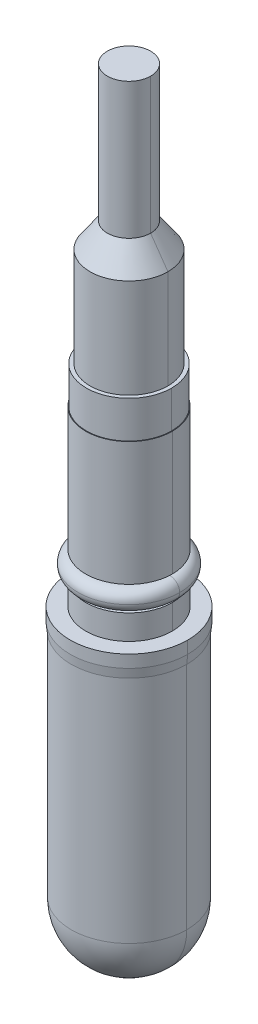
ISO-10303-21;
HEADER;
FILE_DESCRIPTION(('STEP AP214'),'2;1');
FILE_NAME('part.step','',(''),(''),'','','');
FILE_SCHEMA(('AUTOMOTIVE_DESIGN { 1 0 10303 214 1 1 1 1 }'));
ENDSEC;
DATA;
#1=APPLICATION_CONTEXT('core data for automotive mechanical design processes');
#2=APPLICATION_PROTOCOL_DEFINITION('international standard','automotive_design',2000,#1);
#3=PRODUCT_CONTEXT('',#1,'mechanical');
#4=PRODUCT('Part','Part','',(#3));
#5=PRODUCT_RELATED_PRODUCT_CATEGORY('part','',(#4));
#6=PRODUCT_DEFINITION_FORMATION('','',#4);
#7=PRODUCT_DEFINITION_CONTEXT('part definition',#1,'design');
#8=PRODUCT_DEFINITION('design','',#6,#7);
#9=PRODUCT_DEFINITION_SHAPE('','',#8);
#10=(LENGTH_UNIT() NAMED_UNIT(*) SI_UNIT(.MILLI.,.METRE.));
#11=(NAMED_UNIT(*) PLANE_ANGLE_UNIT() SI_UNIT($,.RADIAN.));
#12=(NAMED_UNIT(*) SI_UNIT($,.STERADIAN.) SOLID_ANGLE_UNIT());
#13=UNCERTAINTY_MEASURE_WITH_UNIT(LENGTH_MEASURE(1.E-05),#10,'distance_accuracy_value','');
#14=(GEOMETRIC_REPRESENTATION_CONTEXT(3) GLOBAL_UNCERTAINTY_ASSIGNED_CONTEXT((#13)) GLOBAL_UNIT_ASSIGNED_CONTEXT((#10,
#11,#12)) REPRESENTATION_CONTEXT('',''));
#15=CARTESIAN_POINT('',(0.,0.,0.));
#16=DIRECTION('',(0.,0.,1.));
#17=DIRECTION('',(1.,0.,0.));
#18=AXIS2_PLACEMENT_3D('',#15,#16,#17);
#19=CARTESIAN_POINT('',(0.,3.,0.));
#20=DIRECTION('',(0.,-1.,0.));
#21=DIRECTION('',(-1.,0.,0.));
#22=AXIS2_PLACEMENT_3D('',#19,#20,#21);
#23=TOROIDAL_SURFACE('',#22,3.3,0.8);
#24=CARTESIAN_POINT('',(0.,3.,0.));
#25=DIRECTION('',(0.,-1.,0.));
#26=DIRECTION('',(-1.,0.,0.));
#27=AXIS2_PLACEMENT_3D('',#24,#25,#26);
#28=CIRCLE('',#27,4.1);
#29=CARTESIAN_POINT('',(4.1,3.,0.));
#30=VERTEX_POINT('',#29);
#31=CARTESIAN_POINT('',(-4.1,3.,0.));
#32=VERTEX_POINT('',#31);
#33=EDGE_CURVE('P0_E34',#30,#32,#28,.F.);
#34=ORIENTED_EDGE('',*,*,#33,.F.);
#35=CARTESIAN_POINT('',(3.3,3.,0.));
#36=DIRECTION('',(0.,0.,1.));
#37=DIRECTION('',(1.,0.,0.));
#38=AXIS2_PLACEMENT_3D('',#35,#36,#37);
#39=CIRCLE('',#38,0.8);
#40=CARTESIAN_POINT('',(2.5,3.,0.));
#41=VERTEX_POINT('',#40);
#42=EDGE_CURVE('P0_E39',#41,#30,#39,.T.);
#43=ORIENTED_EDGE('',*,*,#42,.F.);
#44=CARTESIAN_POINT('',(0.,3.,0.));
#45=DIRECTION('',(0.,-1.,0.));
#46=DIRECTION('',(-1.,0.,0.));
#47=AXIS2_PLACEMENT_3D('',#44,#45,#46);
#48=CIRCLE('',#47,2.5);
#49=CARTESIAN_POINT('',(-2.5,3.,0.));
#50=VERTEX_POINT('',#49);
#51=EDGE_CURVE('P0_E42',#50,#41,#48,.T.);
#52=ORIENTED_EDGE('',*,*,#51,.F.);
#53=CARTESIAN_POINT('',(-3.3,3.,0.));
#54=DIRECTION('',(0.,0.,-1.));
#55=DIRECTION('',(-1.,0.,0.));
#56=AXIS2_PLACEMENT_3D('',#53,#54,#55);
#57=CIRCLE('',#56,0.8);
#58=EDGE_CURVE('P0_E44',#32,#50,#57,.F.);
#59=ORIENTED_EDGE('',*,*,#58,.F.);
#60=EDGE_LOOP('',(#34,#43,#52,#59));
#61=FACE_BOUND('',#60,.T.);
#62=ADVANCED_FACE('P0_F16',(#61),#23,.T.);
#63=CARTESIAN_POINT('',(0.,3.,0.));
#64=DIRECTION('',(0.,-1.,0.));
#65=DIRECTION('',(-1.,0.,0.));
#66=AXIS2_PLACEMENT_3D('',#63,#64,#65);
#67=TOROIDAL_SURFACE('',#66,3.3,0.8);
#68=CARTESIAN_POINT('',(0.,3.,0.));
#69=DIRECTION('',(0.,-1.,0.));
#70=DIRECTION('',(-1.,0.,0.));
#71=AXIS2_PLACEMENT_3D('',#68,#69,#70);
#72=CIRCLE('',#71,2.5);
#73=EDGE_CURVE('P0_E48',#41,#50,#72,.T.);
#74=ORIENTED_EDGE('',*,*,#73,.F.);
#75=ORIENTED_EDGE('',*,*,#42,.T.);
#76=CARTESIAN_POINT('',(0.,3.,0.));
#77=DIRECTION('',(0.,-1.,0.));
#78=DIRECTION('',(-1.,0.,0.));
#79=AXIS2_PLACEMENT_3D('',#76,#77,#78);
#80=CIRCLE('',#79,4.1);
#81=EDGE_CURVE('P0_E25',#32,#30,#80,.F.);
#82=ORIENTED_EDGE('',*,*,#81,.F.);
#83=ORIENTED_EDGE('',*,*,#58,.T.);
#84=EDGE_LOOP('',(#74,#75,#82,#83));
#85=FACE_BOUND('',#84,.T.);
#86=ADVANCED_FACE('P0_F52',(#85),#67,.T.);
#87=CARTESIAN_POINT('',(0.,3.,0.));
#88=DIRECTION('',(0.,-1.,0.));
#89=DIRECTION('',(-1.,0.,0.));
#90=AXIS2_PLACEMENT_3D('',#87,#88,#89);
#91=TOROIDAL_SURFACE('',#90,3.3,0.8);
#92=ORIENTED_EDGE('',*,*,#51,.T.);
#93=CARTESIAN_POINT('',(3.3,3.,0.));
#94=DIRECTION('',(0.,0.,1.));
#95=DIRECTION('',(1.,0.,0.));
#96=AXIS2_PLACEMENT_3D('',#93,#94,#95);
#97=CIRCLE('',#96,0.8);
#98=EDGE_CURVE('P0_E11',#30,#41,#97,.T.);
#99=ORIENTED_EDGE('',*,*,#98,.F.);
#100=ORIENTED_EDGE('',*,*,#33,.T.);
#101=CARTESIAN_POINT('',(-3.3,3.,0.));
#102=DIRECTION('',(0.,0.,-1.));
#103=DIRECTION('',(-1.,0.,0.));
#104=AXIS2_PLACEMENT_3D('',#101,#102,#103);
#105=CIRCLE('',#104,0.8);
#106=EDGE_CURVE('P0_E56',#50,#32,#105,.F.);
#107=ORIENTED_EDGE('',*,*,#106,.F.);
#108=EDGE_LOOP('',(#92,#99,#100,#107));
#109=FACE_BOUND('',#108,.T.);
#110=ADVANCED_FACE('P0_F57',(#109),#91,.T.);
#111=CARTESIAN_POINT('',(0.,3.,0.));
#112=DIRECTION('',(0.,-1.,0.));
#113=DIRECTION('',(-1.,0.,0.));
#114=AXIS2_PLACEMENT_3D('',#111,#112,#113);
#115=TOROIDAL_SURFACE('',#114,3.3,0.8);
#116=ORIENTED_EDGE('',*,*,#81,.T.);
#117=ORIENTED_EDGE('',*,*,#98,.T.);
#118=ORIENTED_EDGE('',*,*,#73,.T.);
#119=ORIENTED_EDGE('',*,*,#106,.T.);
#120=EDGE_LOOP('',(#116,#117,#118,#119));
#121=FACE_BOUND('',#120,.T.);
#122=ADVANCED_FACE('P0_F60',(#121),#115,.T.);
#123=CLOSED_SHELL('',(#62,#86,#110,#122));
#124=MANIFOLD_SOLID_BREP('P0_B1',#123);
#125=CARTESIAN_POINT('',(0.,38.,0.));
#126=DIRECTION('',(0.,-1.,0.));
#127=DIRECTION('',(0.,0.,-1.));
#128=AXIS2_PLACEMENT_3D('',#125,#126,#127);
#129=PLANE('',#128);
#130=CARTESIAN_POINT('',(0.,38.,0.));
#131=DIRECTION('',(0.,-1.,0.));
#132=DIRECTION('',(0.,0.,-1.));
#133=AXIS2_PLACEMENT_3D('',#130,#131,#132);
#134=CIRCLE('',#133,1.75000000000037);
#135=CARTESIAN_POINT('',(-1.75000000000037,38.,0.));
#136=VERTEX_POINT('',#135);
#137=CARTESIAN_POINT('',(1.75000000000037,38.,0.));
#138=VERTEX_POINT('',#137);
#139=EDGE_CURVE('P1_E137',#136,#138,#134,.T.);
#140=ORIENTED_EDGE('',*,*,#139,.F.);
#141=CARTESIAN_POINT('',(0.,38.,0.));
#142=DIRECTION('',(0.,-1.,0.));
#143=DIRECTION('',(0.,0.,-1.));
#144=AXIS2_PLACEMENT_3D('',#141,#142,#143);
#145=CIRCLE('',#144,1.75000000000037);
#146=EDGE_CURVE('P1_E19',#138,#136,#145,.T.);
#147=ORIENTED_EDGE('',*,*,#146,.F.);
#148=EDGE_LOOP('',(#140,#147));
#149=FACE_BOUND('',#148,.T.);
#150=ADVANCED_FACE('P1_F16',(#149),#129,.F.);
#151=CARTESIAN_POINT('',(0.,38.0745782775969,0.));
#152=DIRECTION('',(0.,-1.,0.));
#153=DIRECTION('',(0.,0.,-1.));
#154=AXIS2_PLACEMENT_3D('',#151,#152,#153);
#155=CYLINDRICAL_SURFACE('',#154,1.75000000000037);
#156=CARTESIAN_POINT('',(0.,26.9999999999868,0.));
#157=DIRECTION('',(0.,-1.,0.));
#158=DIRECTION('',(-1.,0.,0.));
#159=AXIS2_PLACEMENT_3D('',#156,#157,#158);
#160=CIRCLE('',#159,1.75000000001546);
#161=CARTESIAN_POINT('',(1.7500000000259,26.9999999999759,0.));
#162=VERTEX_POINT('',#161);
#163=CARTESIAN_POINT('',(-1.7500000000259,26.9999999999655,0.));
#164=VERTEX_POINT('',#163);
#165=EDGE_CURVE('P1_E247',#162,#164,#160,.T.);
#166=ORIENTED_EDGE('',*,*,#165,.F.);
#167=DIRECTION('',(0.,-1.,0.));
#168=VECTOR('',#167,1.);
#169=CARTESIAN_POINT('',(1.75000000000037,38.0745782775969,0.));
#170=LINE('',#169,#168);
#171=EDGE_CURVE('P1_E135',#138,#162,#170,.T.);
#172=ORIENTED_EDGE('',*,*,#171,.F.);
#173=ORIENTED_EDGE('',*,*,#146,.T.);
#174=DIRECTION('',(0.,-1.,0.));
#175=VECTOR('',#174,1.);
#176=CARTESIAN_POINT('',(-1.75000000000037,38.0745782775969,0.));
#177=LINE('',#176,#175);
#178=EDGE_CURVE('P1_E132',#164,#136,#177,.F.);
#179=ORIENTED_EDGE('',*,*,#178,.F.);
#180=EDGE_LOOP('',(#166,#172,#173,#179));
#181=FACE_BOUND('',#180,.T.);
#182=ADVANCED_FACE('P1_F130',(#181),#155,.T.);
#183=CARTESIAN_POINT('',(0.,38.0745782775969,0.));
#184=DIRECTION('',(0.,-1.,0.));
#185=DIRECTION('',(0.,0.,-1.));
#186=AXIS2_PLACEMENT_3D('',#183,#184,#185);
#187=CYLINDRICAL_SURFACE('',#186,1.75000000000037);
#188=ORIENTED_EDGE('',*,*,#139,.T.);
#189=ORIENTED_EDGE('',*,*,#171,.T.);
#190=CARTESIAN_POINT('',(0.,26.9999999999868,0.));
#191=DIRECTION('',(0.,-1.,0.));
#192=DIRECTION('',(-1.,0.,0.));
#193=AXIS2_PLACEMENT_3D('',#190,#191,#192);
#194=CIRCLE('',#193,1.75000000001546);
#195=EDGE_CURVE('P1_E142',#164,#162,#194,.T.);
#196=ORIENTED_EDGE('',*,*,#195,.F.);
#197=ORIENTED_EDGE('',*,*,#178,.T.);
#198=EDGE_LOOP('',(#188,#189,#196,#197));
#199=FACE_BOUND('',#198,.T.);
#200=ADVANCED_FACE('P1_F140',(#199),#187,.T.);
#201=CARTESIAN_POINT('',(0.,25.0000000000341,0.));
#202=DIRECTION('',(0.,-1.,0.));
#203=DIRECTION('',(0.,0.,-1.));
#204=AXIS2_PLACEMENT_3D('',#201,#202,#203);
#205=CONICAL_SURFACE('',#204,3.15000000000509,0.610725964391116);
#206=CARTESIAN_POINT('',(0.,25.,0.));
#207=DIRECTION('',(0.,-1.,0.));
#208=DIRECTION('',(0.,0.,-1.));
#209=AXIS2_PLACEMENT_3D('',#206,#207,#208);
#210=CIRCLE('',#209,3.15);
#211=CARTESIAN_POINT('',(3.15000000000127,25.0000000000085,0.));
#212=VERTEX_POINT('',#211);
#213=CARTESIAN_POINT('',(-3.15000000001548,24.9999999999801,0.));
#214=VERTEX_POINT('',#213);
#215=EDGE_CURVE('P1_E231',#212,#214,#210,.T.);
#216=ORIENTED_EDGE('',*,*,#215,.F.);
#217=DIRECTION('',(-0.573462344363226,0.819231920519112,0.));
#218=VECTOR('',#217,1.);
#219=CARTESIAN_POINT('',(349320.649999907,-499000.,-4.27794415898459E-11));
#220=LINE('',#219,#218);
#221=EDGE_CURVE('P1_E236',#162,#212,#220,.F.);
#222=ORIENTED_EDGE('',*,*,#221,.F.);
#223=ORIENTED_EDGE('',*,*,#165,.T.);
#224=DIRECTION('',(0.573462344363226,0.819231920519112,0.));
#225=VECTOR('',#224,1.);
#226=CARTESIAN_POINT('',(-349320.649999907,-499000.,0.));
#227=LINE('',#226,#225);
#228=EDGE_CURVE('P1_E245',#214,#164,#227,.T.);
#229=ORIENTED_EDGE('',*,*,#228,.F.);
#230=EDGE_LOOP('',(#216,#222,#223,#229));
#231=FACE_BOUND('',#230,.T.);
#232=ADVANCED_FACE('P1_F257',(#231),#205,.T.);
#233=CARTESIAN_POINT('',(0.,25.0000000000341,0.));
#234=DIRECTION('',(0.,-1.,0.));
#235=DIRECTION('',(0.,0.,-1.));
#236=AXIS2_PLACEMENT_3D('',#233,#234,#235);
#237=CONICAL_SURFACE('',#236,3.15000000000509,0.610725964391116);
#238=ORIENTED_EDGE('',*,*,#195,.T.);
#239=ORIENTED_EDGE('',*,*,#221,.T.);
#240=CARTESIAN_POINT('',(0.,25.,0.));
#241=DIRECTION('',(0.,-1.,0.));
#242=DIRECTION('',(0.,0.,-1.));
#243=AXIS2_PLACEMENT_3D('',#240,#241,#242);
#244=CIRCLE('',#243,3.15);
#245=EDGE_CURVE('P1_E217',#214,#212,#244,.T.);
#246=ORIENTED_EDGE('',*,*,#245,.F.);
#247=ORIENTED_EDGE('',*,*,#228,.T.);
#248=EDGE_LOOP('',(#238,#239,#246,#247));
#249=FACE_BOUND('',#248,.T.);
#250=ADVANCED_FACE('P1_F260',(#249),#237,.T.);
#251=CARTESIAN_POINT('',(0.,38.0745782775969,0.));
#252=DIRECTION('',(0.,-1.,0.));
#253=DIRECTION('',(0.,0.,-1.));
#254=AXIS2_PLACEMENT_3D('',#251,#252,#253);
#255=CYLINDRICAL_SURFACE('',#254,3.15);
#256=CARTESIAN_POINT('',(0.,17.,0.));
#257=DIRECTION('',(0.,-1.,0.));
#258=DIRECTION('',(0.,0.,-1.));
#259=AXIS2_PLACEMENT_3D('',#256,#257,#258);
#260=CIRCLE('',#259,3.15);
#261=CARTESIAN_POINT('',(-3.15,17.,0.));
#262=VERTEX_POINT('',#261);
#263=CARTESIAN_POINT('',(3.15,17.,0.));
#264=VERTEX_POINT('',#263);
#265=EDGE_CURVE('P1_E211',#262,#264,#260,.F.);
#266=ORIENTED_EDGE('',*,*,#265,.T.);
#267=DIRECTION('',(0.,-1.,0.));
#268=VECTOR('',#267,1.);
#269=CARTESIAN_POINT('',(3.15,38.0745782775969,0.));
#270=LINE('',#269,#268);
#271=EDGE_CURVE('P1_E212',#212,#264,#270,.T.);
#272=ORIENTED_EDGE('',*,*,#271,.F.);
#273=ORIENTED_EDGE('',*,*,#215,.T.);
#274=DIRECTION('',(0.,-1.,0.));
#275=VECTOR('',#274,1.);
#276=CARTESIAN_POINT('',(-3.15,38.0745782775969,0.));
#277=LINE('',#276,#275);
#278=EDGE_CURVE('P1_E222',#262,#214,#277,.F.);
#279=ORIENTED_EDGE('',*,*,#278,.F.);
#280=EDGE_LOOP('',(#266,#272,#273,#279));
#281=FACE_BOUND('',#280,.T.);
#282=ADVANCED_FACE('P1_F261',(#281),#255,.T.);
#283=CARTESIAN_POINT('',(0.,38.0745782775969,0.));
#284=DIRECTION('',(0.,-1.,0.));
#285=DIRECTION('',(0.,0.,-1.));
#286=AXIS2_PLACEMENT_3D('',#283,#284,#285);
#287=CYLINDRICAL_SURFACE('',#286,3.15);
#288=ORIENTED_EDGE('',*,*,#245,.T.);
#289=ORIENTED_EDGE('',*,*,#271,.T.);
#290=CARTESIAN_POINT('',(0.,17.,0.));
#291=DIRECTION('',(0.,-1.,0.));
#292=DIRECTION('',(0.,0.,-1.));
#293=AXIS2_PLACEMENT_3D('',#290,#291,#292);
#294=CIRCLE('',#293,3.15);
#295=EDGE_CURVE('P1_E208',#264,#262,#294,.F.);
#296=ORIENTED_EDGE('',*,*,#295,.T.);
#297=ORIENTED_EDGE('',*,*,#278,.T.);
#298=EDGE_LOOP('',(#288,#289,#296,#297));
#299=FACE_BOUND('',#298,.T.);
#300=ADVANCED_FACE('P1_F262',(#299),#287,.T.);
#301=CARTESIAN_POINT('',(0.,17.,0.));
#302=DIRECTION('',(0.,-1.,0.));
#303=DIRECTION('',(0.,0.,-1.));
#304=AXIS2_PLACEMENT_3D('',#301,#302,#303);
#305=PLANE('',#304);
#306=ORIENTED_EDGE('',*,*,#265,.F.);
#307=ORIENTED_EDGE('',*,*,#295,.F.);
#308=EDGE_LOOP('',(#306,#307));
#309=FACE_BOUND('',#308,.T.);
#310=CARTESIAN_POINT('',(0.,17.,0.));
#311=DIRECTION('',(0.,-1.,0.));
#312=DIRECTION('',(0.,0.,-1.));
#313=AXIS2_PLACEMENT_3D('',#310,#311,#312);
#314=CIRCLE('',#313,3.45);
#315=CARTESIAN_POINT('',(-3.45,17.,0.));
#316=VERTEX_POINT('',#315);
#317=CARTESIAN_POINT('',(3.45,17.,0.));
#318=VERTEX_POINT('',#317);
#319=EDGE_CURVE('P1_E202',#316,#318,#314,.T.);
#320=ORIENTED_EDGE('',*,*,#319,.F.);
#321=CARTESIAN_POINT('',(0.,17.,0.));
#322=DIRECTION('',(0.,-1.,0.));
#323=DIRECTION('',(0.,0.,-1.));
#324=AXIS2_PLACEMENT_3D('',#321,#322,#323);
#325=CIRCLE('',#324,3.45);
#326=EDGE_CURVE('P1_E206',#318,#316,#325,.T.);
#327=ORIENTED_EDGE('',*,*,#326,.F.);
#328=EDGE_LOOP('',(#320,#327));
#329=FACE_BOUND('',#328,.T.);
#330=ADVANCED_FACE('P1_F264',(#309,#329),#305,.F.);
#331=CARTESIAN_POINT('',(0.,38.0745782775969,0.));
#332=DIRECTION('',(0.,-1.,0.));
#333=DIRECTION('',(0.,0.,-1.));
#334=AXIS2_PLACEMENT_3D('',#331,#332,#333);
#335=CYLINDRICAL_SURFACE('',#334,3.45);
#336=CARTESIAN_POINT('',(0.,14.,0.));
#337=DIRECTION('',(0.,-1.,0.));
#338=DIRECTION('',(0.,0.,-1.));
#339=AXIS2_PLACEMENT_3D('',#336,#337,#338);
#340=CIRCLE('',#339,3.45);
#341=CARTESIAN_POINT('',(-3.45,14.,0.));
#342=VERTEX_POINT('',#341);
#343=CARTESIAN_POINT('',(3.45,14.,0.));
#344=VERTEX_POINT('',#343);
#345=EDGE_CURVE('P1_E199',#342,#344,#340,.F.);
#346=ORIENTED_EDGE('',*,*,#345,.T.);
#347=DIRECTION('',(0.,-1.,0.));
#348=VECTOR('',#347,1.);
#349=CARTESIAN_POINT('',(3.45,38.0745782775969,0.));
#350=LINE('',#349,#348);
#351=EDGE_CURVE('P1_E201',#318,#344,#350,.T.);
#352=ORIENTED_EDGE('',*,*,#351,.F.);
#353=ORIENTED_EDGE('',*,*,#326,.T.);
#354=DIRECTION('',(0.,-1.,0.));
#355=VECTOR('',#354,1.);
#356=CARTESIAN_POINT('',(-3.45,38.0745782775969,0.));
#357=LINE('',#356,#355);
#358=EDGE_CURVE('P1_E205',#342,#316,#357,.F.);
#359=ORIENTED_EDGE('',*,*,#358,.F.);
#360=EDGE_LOOP('',(#346,#352,#353,#359));
#361=FACE_BOUND('',#360,.T.);
#362=ADVANCED_FACE('P1_F267',(#361),#335,.T.);
#363=CARTESIAN_POINT('',(0.,38.0745782775969,0.));
#364=DIRECTION('',(0.,-1.,0.));
#365=DIRECTION('',(0.,0.,-1.));
#366=AXIS2_PLACEMENT_3D('',#363,#364,#365);
#367=CYLINDRICAL_SURFACE('',#366,3.45);
#368=ORIENTED_EDGE('',*,*,#319,.T.);
#369=ORIENTED_EDGE('',*,*,#351,.T.);
#370=CARTESIAN_POINT('',(0.,14.,0.));
#371=DIRECTION('',(0.,-1.,0.));
#372=DIRECTION('',(0.,0.,-1.));
#373=AXIS2_PLACEMENT_3D('',#370,#371,#372);
#374=CIRCLE('',#373,3.45);
#375=EDGE_CURVE('P1_E196',#344,#342,#374,.F.);
#376=ORIENTED_EDGE('',*,*,#375,.T.);
#377=ORIENTED_EDGE('',*,*,#358,.T.);
#378=EDGE_LOOP('',(#368,#369,#376,#377));
#379=FACE_BOUND('',#378,.T.);
#380=ADVANCED_FACE('P1_F274',(#379),#367,.T.);
#381=CARTESIAN_POINT('',(0.,14.,0.));
#382=DIRECTION('',(0.,-1.,0.));
#383=DIRECTION('',(0.,0.,-1.));
#384=AXIS2_PLACEMENT_3D('',#381,#382,#383);
#385=PLANE('',#384);
#386=ORIENTED_EDGE('',*,*,#345,.F.);
#387=ORIENTED_EDGE('',*,*,#375,.F.);
#388=EDGE_LOOP('',(#386,#387));
#389=FACE_BOUND('',#388,.T.);
#390=CARTESIAN_POINT('',(0.,14.,0.));
#391=DIRECTION('',(0.,-1.,0.));
#392=DIRECTION('',(0.,0.,-1.));
#393=AXIS2_PLACEMENT_3D('',#390,#391,#392);
#394=CIRCLE('',#393,3.5);
#395=CARTESIAN_POINT('',(-3.5,14.,0.));
#396=VERTEX_POINT('',#395);
#397=CARTESIAN_POINT('',(3.5,14.,0.));
#398=VERTEX_POINT('',#397);
#399=EDGE_CURVE('P1_E193',#396,#398,#394,.T.);
#400=ORIENTED_EDGE('',*,*,#399,.F.);
#401=CARTESIAN_POINT('',(0.,14.,0.));
#402=DIRECTION('',(0.,-1.,0.));
#403=DIRECTION('',(0.,0.,-1.));
#404=AXIS2_PLACEMENT_3D('',#401,#402,#403);
#405=CIRCLE('',#404,3.5);
#406=EDGE_CURVE('P1_E189',#398,#396,#405,.T.);
#407=ORIENTED_EDGE('',*,*,#406,.F.);
#408=EDGE_LOOP('',(#400,#407));
#409=FACE_BOUND('',#408,.T.);
#410=ADVANCED_FACE('P1_F350',(#389,#409),#385,.F.);
#411=CARTESIAN_POINT('',(0.,38.0745782775969,0.));
#412=DIRECTION('',(0.,-1.,0.));
#413=DIRECTION('',(0.,0.,-1.));
#414=AXIS2_PLACEMENT_3D('',#411,#412,#413);
#415=CYLINDRICAL_SURFACE('',#414,3.5);
#416=ORIENTED_EDGE('',*,*,#399,.T.);
#417=DIRECTION('',(0.,-1.,0.));
#418=VECTOR('',#417,1.);
#419=CARTESIAN_POINT('',(3.5,38.0745782775969,0.));
#420=LINE('',#419,#418);
#421=CARTESIAN_POINT('',(3.5,4.,0.));
#422=VERTEX_POINT('',#421);
#423=EDGE_CURVE('P1_E188',#422,#398,#420,.F.);
#424=ORIENTED_EDGE('',*,*,#423,.F.);
#425=CARTESIAN_POINT('',(0.,4.,0.));
#426=DIRECTION('',(0.,-1.,0.));
#427=DIRECTION('',(0.,0.,-1.));
#428=AXIS2_PLACEMENT_3D('',#425,#426,#427);
#429=CIRCLE('',#428,3.5);
#430=CARTESIAN_POINT('',(-3.5,4.,0.));
#431=VERTEX_POINT('',#430);
#432=EDGE_CURVE('P1_E185',#431,#422,#429,.T.);
#433=ORIENTED_EDGE('',*,*,#432,.F.);
#434=DIRECTION('',(0.,-1.,0.));
#435=VECTOR('',#434,1.);
#436=CARTESIAN_POINT('',(-3.5,38.0745782775969,0.));
#437=LINE('',#436,#435);
#438=EDGE_CURVE('P1_E192',#396,#431,#437,.T.);
#439=ORIENTED_EDGE('',*,*,#438,.F.);
#440=EDGE_LOOP('',(#416,#424,#433,#439));
#441=FACE_BOUND('',#440,.T.);
#442=ADVANCED_FACE('P1_F346',(#441),#415,.T.);
#443=CARTESIAN_POINT('',(0.,38.0745782775969,0.));
#444=DIRECTION('',(0.,-1.,0.));
#445=DIRECTION('',(0.,0.,-1.));
#446=AXIS2_PLACEMENT_3D('',#443,#444,#445);
#447=CYLINDRICAL_SURFACE('',#446,3.5);
#448=CARTESIAN_POINT('',(0.,4.,0.));
#449=DIRECTION('',(0.,-1.,0.));
#450=DIRECTION('',(0.,0.,-1.));
#451=AXIS2_PLACEMENT_3D('',#448,#449,#450);
#452=CIRCLE('',#451,3.5);
#453=EDGE_CURVE('P1_E182',#422,#431,#452,.T.);
#454=ORIENTED_EDGE('',*,*,#453,.F.);
#455=ORIENTED_EDGE('',*,*,#423,.T.);
#456=ORIENTED_EDGE('',*,*,#406,.T.);
#457=ORIENTED_EDGE('',*,*,#438,.T.);
#458=EDGE_LOOP('',(#454,#455,#456,#457));
#459=FACE_BOUND('',#458,.T.);
#460=ADVANCED_FACE('P1_F342',(#459),#447,.T.);
#461=CARTESIAN_POINT('',(0.,4.,0.));
#462=DIRECTION('',(0.,-1.,0.));
#463=DIRECTION('',(0.,0.,-1.));
#464=AXIS2_PLACEMENT_3D('',#461,#462,#463);
#465=PLANE('',#464);
#466=CARTESIAN_POINT('',(0.,4.,0.));
#467=DIRECTION('',(0.,-1.,0.));
#468=DIRECTION('',(0.,0.,-1.));
#469=AXIS2_PLACEMENT_3D('',#466,#467,#468);
#470=CIRCLE('',#469,2.5);
#471=CARTESIAN_POINT('',(2.5,4.,0.));
#472=VERTEX_POINT('',#471);
#473=CARTESIAN_POINT('',(-2.5,4.,0.));
#474=VERTEX_POINT('',#473);
#475=EDGE_CURVE('P1_E180',#472,#474,#470,.T.);
#476=ORIENTED_EDGE('',*,*,#475,.F.);
#477=CARTESIAN_POINT('',(0.,4.,0.));
#478=DIRECTION('',(0.,-1.,0.));
#479=DIRECTION('',(0.,0.,-1.));
#480=AXIS2_PLACEMENT_3D('',#477,#478,#479);
#481=CIRCLE('',#480,2.5);
#482=EDGE_CURVE('P1_E176',#474,#472,#481,.T.);
#483=ORIENTED_EDGE('',*,*,#482,.F.);
#484=EDGE_LOOP('',(#476,#483));
#485=FACE_BOUND('',#484,.T.);
#486=ORIENTED_EDGE('',*,*,#432,.T.);
#487=ORIENTED_EDGE('',*,*,#453,.T.);
#488=EDGE_LOOP('',(#486,#487));
#489=FACE_BOUND('',#488,.T.);
#490=ADVANCED_FACE('P1_F338',(#485,#489),#465,.T.);
#491=CARTESIAN_POINT('',(0.,38.0745782775969,0.));
#492=DIRECTION('',(0.,-1.,0.));
#493=DIRECTION('',(0.,0.,-1.));
#494=AXIS2_PLACEMENT_3D('',#491,#492,#493);
#495=CYLINDRICAL_SURFACE('',#494,2.5);
#496=CARTESIAN_POINT('',(0.,2.,0.));
#497=DIRECTION('',(0.,-1.,0.));
#498=DIRECTION('',(0.,0.,-1.));
#499=AXIS2_PLACEMENT_3D('',#496,#497,#498);
#500=CIRCLE('',#499,2.5);
#501=CARTESIAN_POINT('',(-2.5,2.,0.));
#502=VERTEX_POINT('',#501);
#503=CARTESIAN_POINT('',(2.5,2.,0.));
#504=VERTEX_POINT('',#503);
#505=EDGE_CURVE('P1_E173',#502,#504,#500,.F.);
#506=ORIENTED_EDGE('',*,*,#505,.T.);
#507=DIRECTION('',(0.,-1.,0.));
#508=VECTOR('',#507,1.);
#509=CARTESIAN_POINT('',(2.5,38.0745782775969,0.));
#510=LINE('',#509,#508);
#511=EDGE_CURVE('P1_E175',#472,#504,#510,.T.);
#512=ORIENTED_EDGE('',*,*,#511,.F.);
#513=ORIENTED_EDGE('',*,*,#475,.T.);
#514=DIRECTION('',(0.,-1.,0.));
#515=VECTOR('',#514,1.);
#516=CARTESIAN_POINT('',(-2.5,38.0745782775969,0.));
#517=LINE('',#516,#515);
#518=EDGE_CURVE('P1_E179',#502,#474,#517,.F.);
#519=ORIENTED_EDGE('',*,*,#518,.F.);
#520=EDGE_LOOP('',(#506,#512,#513,#519));
#521=FACE_BOUND('',#520,.T.);
#522=ADVANCED_FACE('P1_F334',(#521),#495,.T.);
#523=CARTESIAN_POINT('',(0.,38.0745782775969,0.));
#524=DIRECTION('',(0.,-1.,0.));
#525=DIRECTION('',(0.,0.,-1.));
#526=AXIS2_PLACEMENT_3D('',#523,#524,#525);
#527=CYLINDRICAL_SURFACE('',#526,2.5);
#528=ORIENTED_EDGE('',*,*,#482,.T.);
#529=ORIENTED_EDGE('',*,*,#511,.T.);
#530=CARTESIAN_POINT('',(0.,2.,0.));
#531=DIRECTION('',(0.,-1.,0.));
#532=DIRECTION('',(0.,0.,-1.));
#533=AXIS2_PLACEMENT_3D('',#530,#531,#532);
#534=CIRCLE('',#533,2.5);
#535=EDGE_CURVE('P1_E170',#504,#502,#534,.F.);
#536=ORIENTED_EDGE('',*,*,#535,.T.);
#537=ORIENTED_EDGE('',*,*,#518,.T.);
#538=EDGE_LOOP('',(#528,#529,#536,#537));
#539=FACE_BOUND('',#538,.T.);
#540=ADVANCED_FACE('P1_F330',(#539),#527,.T.);
#541=CARTESIAN_POINT('',(0.,2.,0.));
#542=DIRECTION('',(0.,-1.,0.));
#543=DIRECTION('',(0.,0.,-1.));
#544=AXIS2_PLACEMENT_3D('',#541,#542,#543);
#545=PLANE('',#544);
#546=ORIENTED_EDGE('',*,*,#505,.F.);
#547=ORIENTED_EDGE('',*,*,#535,.F.);
#548=EDGE_LOOP('',(#546,#547));
#549=FACE_BOUND('',#548,.T.);
#550=CARTESIAN_POINT('',(0.,2.,0.));
#551=DIRECTION('',(0.,-1.,0.));
#552=DIRECTION('',(0.,0.,-1.));
#553=AXIS2_PLACEMENT_3D('',#550,#551,#552);
#554=CIRCLE('',#553,3.5);
#555=CARTESIAN_POINT('',(-3.5,2.,0.));
#556=VERTEX_POINT('',#555);
#557=CARTESIAN_POINT('',(3.5,2.,0.));
#558=VERTEX_POINT('',#557);
#559=EDGE_CURVE('P1_E164',#556,#558,#554,.T.);
#560=ORIENTED_EDGE('',*,*,#559,.F.);
#561=CARTESIAN_POINT('',(0.,2.,0.));
#562=DIRECTION('',(0.,-1.,0.));
#563=DIRECTION('',(0.,0.,-1.));
#564=AXIS2_PLACEMENT_3D('',#561,#562,#563);
#565=CIRCLE('',#564,3.5);
#566=EDGE_CURVE('P1_E168',#558,#556,#565,.T.);
#567=ORIENTED_EDGE('',*,*,#566,.F.);
#568=EDGE_LOOP('',(#560,#567));
#569=FACE_BOUND('',#568,.T.);
#570=ADVANCED_FACE('P1_F326',(#549,#569),#545,.F.);
#571=CARTESIAN_POINT('',(0.,38.0745782775969,0.));
#572=DIRECTION('',(0.,-1.,0.));
#573=DIRECTION('',(0.,0.,-1.));
#574=AXIS2_PLACEMENT_3D('',#571,#572,#573);
#575=CYLINDRICAL_SURFACE('',#574,3.5);
#576=CARTESIAN_POINT('',(0.,0.,0.));
#577=DIRECTION('',(0.,-1.,0.));
#578=DIRECTION('',(0.,0.,-1.));
#579=AXIS2_PLACEMENT_3D('',#576,#577,#578);
#580=CIRCLE('',#579,3.5);
#581=CARTESIAN_POINT('',(-3.5,0.,0.));
#582=VERTEX_POINT('',#581);
#583=CARTESIAN_POINT('',(3.5,0.,0.));
#584=VERTEX_POINT('',#583);
#585=EDGE_CURVE('P1_E161',#582,#584,#580,.F.);
#586=ORIENTED_EDGE('',*,*,#585,.T.);
#587=DIRECTION('',(0.,-1.,0.));
#588=VECTOR('',#587,1.);
#589=CARTESIAN_POINT('',(3.5,38.0745782775969,0.));
#590=LINE('',#589,#588);
#591=EDGE_CURVE('P1_E163',#558,#584,#590,.T.);
#592=ORIENTED_EDGE('',*,*,#591,.F.);
#593=ORIENTED_EDGE('',*,*,#566,.T.);
#594=DIRECTION('',(0.,-1.,0.));
#595=VECTOR('',#594,1.);
#596=CARTESIAN_POINT('',(-3.5,38.0745782775969,0.));
#597=LINE('',#596,#595);
#598=EDGE_CURVE('P1_E167',#582,#556,#597,.F.);
#599=ORIENTED_EDGE('',*,*,#598,.F.);
#600=EDGE_LOOP('',(#586,#592,#593,#599));
#601=FACE_BOUND('',#600,.T.);
#602=ADVANCED_FACE('P1_F322',(#601),#575,.T.);
#603=CARTESIAN_POINT('',(0.,38.0745782775969,0.));
#604=DIRECTION('',(0.,-1.,0.));
#605=DIRECTION('',(0.,0.,-1.));
#606=AXIS2_PLACEMENT_3D('',#603,#604,#605);
#607=CYLINDRICAL_SURFACE('',#606,3.5);
#608=ORIENTED_EDGE('',*,*,#559,.T.);
#609=ORIENTED_EDGE('',*,*,#591,.T.);
#610=CARTESIAN_POINT('',(0.,0.,0.));
#611=DIRECTION('',(0.,-1.,0.));
#612=DIRECTION('',(0.,0.,-1.));
#613=AXIS2_PLACEMENT_3D('',#610,#611,#612);
#614=CIRCLE('',#613,3.5);
#615=EDGE_CURVE('P1_E158',#584,#582,#614,.F.);
#616=ORIENTED_EDGE('',*,*,#615,.T.);
#617=ORIENTED_EDGE('',*,*,#598,.T.);
#618=EDGE_LOOP('',(#608,#609,#616,#617));
#619=FACE_BOUND('',#618,.T.);
#620=ADVANCED_FACE('P1_F318',(#619),#607,.T.);
#621=CARTESIAN_POINT('',(0.,0.,0.));
#622=DIRECTION('',(0.,-1.,0.));
#623=DIRECTION('',(0.,0.,-1.));
#624=AXIS2_PLACEMENT_3D('',#621,#622,#623);
#625=PLANE('',#624);
#626=ORIENTED_EDGE('',*,*,#585,.F.);
#627=ORIENTED_EDGE('',*,*,#615,.F.);
#628=EDGE_LOOP('',(#626,#627));
#629=FACE_BOUND('',#628,.T.);
#630=CARTESIAN_POINT('',(0.,0.,0.));
#631=DIRECTION('',(0.,-1.,0.));
#632=DIRECTION('',(0.,0.,-1.));
#633=AXIS2_PLACEMENT_3D('',#630,#631,#632);
#634=CIRCLE('',#633,4.75);
#635=CARTESIAN_POINT('',(-4.75,0.,0.));
#636=VERTEX_POINT('',#635);
#637=CARTESIAN_POINT('',(4.75,0.,0.));
#638=VERTEX_POINT('',#637);
#639=EDGE_CURVE('P1_E155',#636,#638,#634,.T.);
#640=ORIENTED_EDGE('',*,*,#639,.F.);
#641=CARTESIAN_POINT('',(0.,0.,0.));
#642=DIRECTION('',(0.,-1.,0.));
#643=DIRECTION('',(0.,0.,-1.));
#644=AXIS2_PLACEMENT_3D('',#641,#642,#643);
#645=CIRCLE('',#644,4.75);
#646=EDGE_CURVE('P1_E151',#638,#636,#645,.T.);
#647=ORIENTED_EDGE('',*,*,#646,.F.);
#648=EDGE_LOOP('',(#640,#647));
#649=FACE_BOUND('',#648,.T.);
#650=ADVANCED_FACE('P1_F314',(#629,#649),#625,.F.);
#651=CARTESIAN_POINT('',(0.,38.0745782775969,0.));
#652=DIRECTION('',(0.,-1.,0.));
#653=DIRECTION('',(0.,0.,-1.));
#654=AXIS2_PLACEMENT_3D('',#651,#652,#653);
#655=CYLINDRICAL_SURFACE('',#654,4.75);
#656=ORIENTED_EDGE('',*,*,#639,.T.);
#657=DIRECTION('',(0.,-1.,0.));
#658=VECTOR('',#657,1.);
#659=CARTESIAN_POINT('',(4.75,38.0745782775969,0.));
#660=LINE('',#659,#658);
#661=CARTESIAN_POINT('',(4.74999999999679,-0.999999999994089,0.));
#662=VERTEX_POINT('',#661);
#663=EDGE_CURVE('P1_E293',#662,#638,#660,.F.);
#664=ORIENTED_EDGE('',*,*,#663,.F.);
#665=CARTESIAN_POINT('',(0.,-0.999999999976353,0.));
#666=DIRECTION('',(0.,1.,0.));
#667=DIRECTION('',(-1.,0.,0.));
#668=AXIS2_PLACEMENT_3D('',#665,#666,#667);
#669=CIRCLE('',#668,4.74999999998715);
#670=CARTESIAN_POINT('',(-4.74999999999679,-0.999999999994089,0.));
#671=VERTEX_POINT('',#670);
#672=EDGE_CURVE('P1_E296',#671,#662,#669,.F.);
#673=ORIENTED_EDGE('',*,*,#672,.F.);
#674=DIRECTION('',(0.,-1.,0.));
#675=VECTOR('',#674,1.);
#676=CARTESIAN_POINT('',(-4.75,38.0745782775969,0.));
#677=LINE('',#676,#675);
#678=EDGE_CURVE('P1_E154',#636,#671,#677,.T.);
#679=ORIENTED_EDGE('',*,*,#678,.F.);
#680=EDGE_LOOP('',(#656,#664,#673,#679));
#681=FACE_BOUND('',#680,.T.);
#682=ADVANCED_FACE('P1_F310',(#681),#655,.T.);
#683=CARTESIAN_POINT('',(0.,38.0745782775969,0.));
#684=DIRECTION('',(0.,-1.,0.));
#685=DIRECTION('',(0.,0.,-1.));
#686=AXIS2_PLACEMENT_3D('',#683,#684,#685);
#687=CYLINDRICAL_SURFACE('',#686,4.75);
#688=CARTESIAN_POINT('',(0.,-0.999999999976353,0.));
#689=DIRECTION('',(0.,1.,0.));
#690=DIRECTION('',(-1.,0.,0.));
#691=AXIS2_PLACEMENT_3D('',#688,#689,#690);
#692=CIRCLE('',#691,4.74999999998715);
#693=EDGE_CURVE('P1_E404',#662,#671,#692,.F.);
#694=ORIENTED_EDGE('',*,*,#693,.F.);
#695=ORIENTED_EDGE('',*,*,#663,.T.);
#696=ORIENTED_EDGE('',*,*,#646,.T.);
#697=ORIENTED_EDGE('',*,*,#678,.T.);
#698=EDGE_LOOP('',(#694,#695,#696,#697));
#699=FACE_BOUND('',#698,.T.);
#700=ADVANCED_FACE('P1_F306',(#699),#687,.T.);
#701=CARTESIAN_POINT('',(0.,-20.33,0.));
#702=DIRECTION('',(0.,-1.,0.));
#703=DIRECTION('',(-1.,0.,0.));
#704=AXIS2_PLACEMENT_3D('',#701,#702,#703);
#705=SPHERICAL_SURFACE('',#704,4.67);
#706=CARTESIAN_POINT('',(0.,-20.33,0.));
#707=DIRECTION('',(0.,-1.,0.));
#708=DIRECTION('',(0.,0.,-1.));
#709=AXIS2_PLACEMENT_3D('',#706,#707,#708);
#710=CIRCLE('',#709,4.67);
#711=CARTESIAN_POINT('',(4.67,-20.33,0.));
#712=VERTEX_POINT('',#711);
#713=CARTESIAN_POINT('',(-4.67,-20.33,0.));
#714=VERTEX_POINT('',#713);
#715=EDGE_CURVE('P1_E34',#712,#714,#710,.F.);
#716=ORIENTED_EDGE('',*,*,#715,.F.);
#717=CARTESIAN_POINT('',(0.,-20.33,0.));
#718=DIRECTION('',(0.,0.,1.));
#719=DIRECTION('',(1.,0.,0.));
#720=AXIS2_PLACEMENT_3D('',#717,#718,#719);
#721=CIRCLE('',#720,4.67);
#722=CARTESIAN_POINT('',(0.,-25.,0.));
#723=VERTEX_POINT('',#722);
#724=EDGE_CURVE('P1_E394',#723,#712,#721,.T.);
#725=ORIENTED_EDGE('',*,*,#724,.F.);
#726=CARTESIAN_POINT('',(0.,-20.33,0.));
#727=DIRECTION('',(0.,0.,-1.));
#728=DIRECTION('',(-1.,0.,0.));
#729=AXIS2_PLACEMENT_3D('',#726,#727,#728);
#730=CIRCLE('',#729,4.67);
#731=EDGE_CURVE('P1_E396',#714,#723,#730,.F.);
#732=ORIENTED_EDGE('',*,*,#731,.F.);
#733=EDGE_LOOP('',(#716,#725,#732));
#734=FACE_BOUND('',#733,.T.);
#735=ADVANCED_FACE('P1_F301',(#734),#705,.T.);
#736=CARTESIAN_POINT('',(0.,-1.00000000014688,0.));
#737=DIRECTION('',(0.,1.,0.));
#738=DIRECTION('',(0.,0.,1.));
#739=AXIS2_PLACEMENT_3D('',#736,#737,#738);
#740=CONICAL_SURFACE('',#739,4.74999999997294,0.106869980969991);
#741=ORIENTED_EDGE('',*,*,#672,.T.);
#742=DIRECTION('',(-0.106666666666667,-0.994294836666782,0.));
#743=VECTOR('',#742,1.);
#744=CARTESIAN_POINT('',(53536.9331819705,499000.,6.55638338574659E-12));
#745=LINE('',#744,#743);
#746=CARTESIAN_POINT('',(4.66999999998731,-1.74572112751504,0.));
#747=VERTEX_POINT('',#746);
#748=EDGE_CURVE('P1_E399',#747,#662,#745,.F.);
#749=ORIENTED_EDGE('',*,*,#748,.F.);
#750=CARTESIAN_POINT('',(0.,-1.74572112750009,0.));
#751=DIRECTION('',(0.,-1.,0.));
#752=DIRECTION('',(0.,0.,-1.));
#753=AXIS2_PLACEMENT_3D('',#750,#751,#752);
#754=CIRCLE('',#753,4.67);
#755=CARTESIAN_POINT('',(-4.66999999998731,-1.74572112751504,0.));
#756=VERTEX_POINT('',#755);
#757=EDGE_CURVE('P1_E419',#756,#747,#754,.T.);
#758=ORIENTED_EDGE('',*,*,#757,.F.);
#759=DIRECTION('',(0.106666666666667,-0.994294836666782,0.));
#760=VECTOR('',#759,1.);
#761=CARTESIAN_POINT('',(-53536.9331819705,499000.,0.));
#762=LINE('',#761,#760);
#763=EDGE_CURVE('P1_E402',#671,#756,#762,.T.);
#764=ORIENTED_EDGE('',*,*,#763,.F.);
#765=EDGE_LOOP('',(#741,#749,#758,#764));
#766=FACE_BOUND('',#765,.T.);
#767=ADVANCED_FACE('P1_F305',(#766),#740,.T.);
#768=CARTESIAN_POINT('',(0.,-1.00000000014688,0.));
#769=DIRECTION('',(0.,1.,0.));
#770=DIRECTION('',(0.,0.,1.));
#771=AXIS2_PLACEMENT_3D('',#768,#769,#770);
#772=CONICAL_SURFACE('',#771,4.74999999997294,0.106869980969991);
#773=CARTESIAN_POINT('',(0.,-1.74572112750009,0.));
#774=DIRECTION('',(0.,-1.,0.));
#775=DIRECTION('',(0.,0.,-1.));
#776=AXIS2_PLACEMENT_3D('',#773,#774,#775);
#777=CIRCLE('',#776,4.67);
#778=EDGE_CURVE('P1_E414',#747,#756,#777,.T.);
#779=ORIENTED_EDGE('',*,*,#778,.F.);
#780=ORIENTED_EDGE('',*,*,#748,.T.);
#781=ORIENTED_EDGE('',*,*,#693,.T.);
#782=ORIENTED_EDGE('',*,*,#763,.T.);
#783=EDGE_LOOP('',(#779,#780,#781,#782));
#784=FACE_BOUND('',#783,.T.);
#785=ADVANCED_FACE('P1_F388',(#784),#772,.T.);
#786=CARTESIAN_POINT('',(0.,-20.33,0.));
#787=DIRECTION('',(0.,-1.,0.));
#788=DIRECTION('',(-1.,0.,0.));
#789=AXIS2_PLACEMENT_3D('',#786,#787,#788);
#790=SPHERICAL_SURFACE('',#789,4.67);
#791=ORIENTED_EDGE('',*,*,#731,.T.);
#792=ORIENTED_EDGE('',*,*,#724,.T.);
#793=CARTESIAN_POINT('',(0.,-20.33,0.));
#794=DIRECTION('',(0.,-1.,0.));
#795=DIRECTION('',(0.,0.,-1.));
#796=AXIS2_PLACEMENT_3D('',#793,#794,#795);
#797=CIRCLE('',#796,4.67);
#798=EDGE_CURVE('P1_E25',#714,#712,#797,.F.);
#799=ORIENTED_EDGE('',*,*,#798,.F.);
#800=EDGE_LOOP('',(#791,#792,#799));
#801=FACE_BOUND('',#800,.T.);
#802=ADVANCED_FACE('P1_F381',(#801),#790,.T.);
#803=CARTESIAN_POINT('',(0.,38.0745782775969,0.));
#804=DIRECTION('',(0.,-1.,0.));
#805=DIRECTION('',(0.,0.,-1.));
#806=AXIS2_PLACEMENT_3D('',#803,#804,#805);
#807=CYLINDRICAL_SURFACE('',#806,4.67);
#808=ORIENTED_EDGE('',*,*,#757,.T.);
#809=DIRECTION('',(0.,-1.,0.));
#810=VECTOR('',#809,1.);
#811=CARTESIAN_POINT('',(4.67,38.0745782775969,0.));
#812=LINE('',#811,#810);
#813=EDGE_CURVE('P1_E11',#712,#747,#812,.F.);
#814=ORIENTED_EDGE('',*,*,#813,.F.);
#815=ORIENTED_EDGE('',*,*,#715,.T.);
#816=DIRECTION('',(0.,-1.,0.));
#817=VECTOR('',#816,1.);
#818=CARTESIAN_POINT('',(-4.67,38.0745782775969,0.));
#819=LINE('',#818,#817);
#820=EDGE_CURVE('P1_E418',#756,#714,#819,.T.);
#821=ORIENTED_EDGE('',*,*,#820,.F.);
#822=EDGE_LOOP('',(#808,#814,#815,#821));
#823=FACE_BOUND('',#822,.T.);
#824=ADVANCED_FACE('P1_F375',(#823),#807,.T.);
#825=CARTESIAN_POINT('',(0.,38.0745782775969,0.));
#826=DIRECTION('',(0.,-1.,0.));
#827=DIRECTION('',(0.,0.,-1.));
#828=AXIS2_PLACEMENT_3D('',#825,#826,#827);
#829=CYLINDRICAL_SURFACE('',#828,4.67);
#830=ORIENTED_EDGE('',*,*,#798,.T.);
#831=ORIENTED_EDGE('',*,*,#813,.T.);
#832=ORIENTED_EDGE('',*,*,#778,.T.);
#833=ORIENTED_EDGE('',*,*,#820,.T.);
#834=EDGE_LOOP('',(#830,#831,#832,#833));
#835=FACE_BOUND('',#834,.T.);
#836=ADVANCED_FACE('P1_F373',(#835),#829,.T.);
#837=CLOSED_SHELL('',(#150,#182,#200,#232,#250,#282,#300,#330,#362,#380,#410,#442,#460,#490,
#522,#540,#570,#602,#620,#650,#682,#700,#735,#767,#785,#802,#824,#836));
#838=MANIFOLD_SOLID_BREP('P1_B1',#837);
#839=ADVANCED_BREP_SHAPE_REPRESENTATION('',(#18,#124,#838),#14);
#840=SHAPE_DEFINITION_REPRESENTATION(#9,#839);
ENDSEC;
END-ISO-10303-21;
